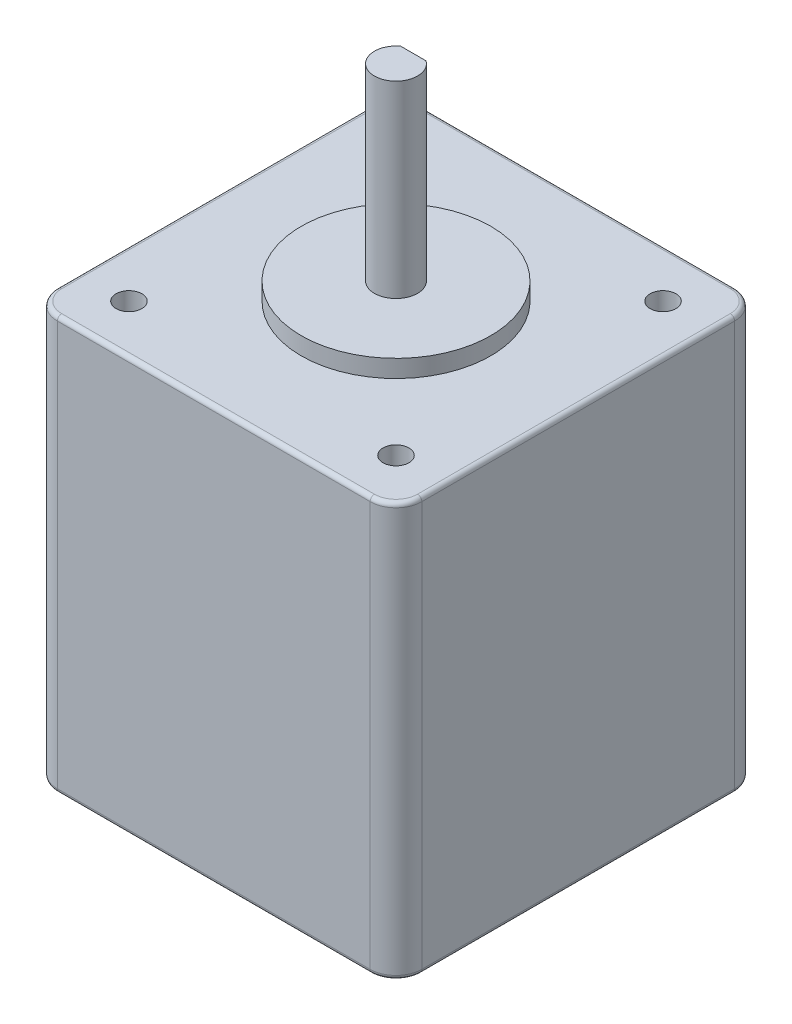
ISO-10303-21;
HEADER;
FILE_DESCRIPTION(('STEP AP214'),'2;1');
FILE_NAME('part.step','',(''),(''),'','','');
FILE_SCHEMA(('AUTOMOTIVE_DESIGN { 1 0 10303 214 1 1 1 1 }'));
ENDSEC;
DATA;
#1=APPLICATION_CONTEXT('core data for automotive mechanical design processes');
#2=APPLICATION_PROTOCOL_DEFINITION('international standard','automotive_design',2000,#1);
#3=PRODUCT_CONTEXT('',#1,'mechanical');
#4=PRODUCT('Part','Part','',(#3));
#5=PRODUCT_RELATED_PRODUCT_CATEGORY('part','',(#4));
#6=PRODUCT_DEFINITION_FORMATION('','',#4);
#7=PRODUCT_DEFINITION_CONTEXT('part definition',#1,'design');
#8=PRODUCT_DEFINITION('design','',#6,#7);
#9=PRODUCT_DEFINITION_SHAPE('','',#8);
#10=(LENGTH_UNIT() NAMED_UNIT(*) SI_UNIT(.MILLI.,.METRE.));
#11=(NAMED_UNIT(*) PLANE_ANGLE_UNIT() SI_UNIT($,.RADIAN.));
#12=(NAMED_UNIT(*) SI_UNIT($,.STERADIAN.) SOLID_ANGLE_UNIT());
#13=UNCERTAINTY_MEASURE_WITH_UNIT(LENGTH_MEASURE(1.E-05),#10,'distance_accuracy_value','');
#14=(GEOMETRIC_REPRESENTATION_CONTEXT(3) GLOBAL_UNCERTAINTY_ASSIGNED_CONTEXT((#13)) GLOBAL_UNIT_ASSIGNED_CONTEXT((#10,
#11,#12)) REPRESENTATION_CONTEXT('',''));
#15=CARTESIAN_POINT('',(0.,0.,0.));
#16=DIRECTION('',(0.,0.,1.));
#17=DIRECTION('',(1.,0.,0.));
#18=AXIS2_PLACEMENT_3D('',#15,#16,#17);
#19=CARTESIAN_POINT('',(0.,48.,0.));
#20=DIRECTION('',(0.,-1.,0.));
#21=DIRECTION('',(0.,0.,-1.));
#22=AXIS2_PLACEMENT_3D('',#19,#20,#21);
#23=PLANE('',#22);
#24=DIRECTION('',(0.,0.,1.));
#25=VECTOR('',#24,1.);
#26=CARTESIAN_POINT('',(0.5,48.,0.));
#27=LINE('',#26,#25);
#28=CARTESIAN_POINT('',(0.5,48.,-39.3));
#29=VERTEX_POINT('',#28);
#30=CARTESIAN_POINT('',(0.5,48.,-3.));
#31=VERTEX_POINT('',#30);
#32=EDGE_CURVE('E50',#29,#31,#27,.T.);
#33=ORIENTED_EDGE('',*,*,#32,.T.);
#34=CARTESIAN_POINT('',(3.,48.,-3.));
#35=DIRECTION('',(0.,-1.,0.));
#36=DIRECTION('',(0.,0.,-1.));
#37=AXIS2_PLACEMENT_3D('',#34,#35,#36);
#38=CIRCLE('',#37,2.5);
#39=CARTESIAN_POINT('',(3.,48.,-0.5));
#40=VERTEX_POINT('',#39);
#41=EDGE_CURVE('E300',#31,#40,#38,.F.);
#42=ORIENTED_EDGE('',*,*,#41,.T.);
#43=DIRECTION('',(1.,0.,0.));
#44=VECTOR('',#43,1.);
#45=CARTESIAN_POINT('',(0.,48.,-0.5));
#46=LINE('',#45,#44);
#47=CARTESIAN_POINT('',(39.3,48.,-0.5));
#48=VERTEX_POINT('',#47);
#49=EDGE_CURVE('E288',#40,#48,#46,.T.);
#50=ORIENTED_EDGE('',*,*,#49,.T.);
#51=CARTESIAN_POINT('',(39.3,48.,-3.));
#52=DIRECTION('',(0.,-1.,0.));
#53=DIRECTION('',(0.,0.,-1.));
#54=AXIS2_PLACEMENT_3D('',#51,#52,#53);
#55=CIRCLE('',#54,2.5);
#56=CARTESIAN_POINT('',(41.8,48.,-3.));
#57=VERTEX_POINT('',#56);
#58=EDGE_CURVE('E290',#48,#57,#55,.F.);
#59=ORIENTED_EDGE('',*,*,#58,.T.);
#60=DIRECTION('',(0.,0.,-1.));
#61=VECTOR('',#60,1.);
#62=CARTESIAN_POINT('',(41.8,48.,0.));
#63=LINE('',#62,#61);
#64=CARTESIAN_POINT('',(41.8,48.,-39.3));
#65=VERTEX_POINT('',#64);
#66=EDGE_CURVE('E292',#57,#65,#63,.T.);
#67=ORIENTED_EDGE('',*,*,#66,.T.);
#68=CARTESIAN_POINT('',(39.3,48.,-39.3));
#69=DIRECTION('',(0.,-1.,0.));
#70=DIRECTION('',(0.,0.,-1.));
#71=AXIS2_PLACEMENT_3D('',#68,#69,#70);
#72=CIRCLE('',#71,2.5);
#73=CARTESIAN_POINT('',(39.3,48.,-41.8));
#74=VERTEX_POINT('',#73);
#75=EDGE_CURVE('E294',#65,#74,#72,.F.);
#76=ORIENTED_EDGE('',*,*,#75,.T.);
#77=DIRECTION('',(-1.,0.,0.));
#78=VECTOR('',#77,1.);
#79=CARTESIAN_POINT('',(0.,48.,-41.8));
#80=LINE('',#79,#78);
#81=CARTESIAN_POINT('',(3.,48.,-41.8));
#82=VERTEX_POINT('',#81);
#83=EDGE_CURVE('E296',#74,#82,#80,.T.);
#84=ORIENTED_EDGE('',*,*,#83,.T.);
#85=CARTESIAN_POINT('',(3.,48.,-39.3));
#86=DIRECTION('',(0.,-1.,0.));
#87=DIRECTION('',(0.,0.,-1.));
#88=AXIS2_PLACEMENT_3D('',#85,#86,#87);
#89=CIRCLE('',#88,2.5);
#90=EDGE_CURVE('E55',#82,#29,#89,.F.);
#91=ORIENTED_EDGE('',*,*,#90,.T.);
#92=EDGE_LOOP('',(#33,#42,#50,#59,#67,#76,#84,#91));
#93=FACE_BOUND('',#92,.T.);
#94=CARTESIAN_POINT('',(21.15,48.,-21.15));
#95=DIRECTION('',(0.,1.,0.));
#96=DIRECTION('',(0.,0.,1.));
#97=AXIS2_PLACEMENT_3D('',#94,#95,#96);
#98=CIRCLE('',#97,11.);
#99=CARTESIAN_POINT('',(21.15,48.,-10.15));
#100=VERTEX_POINT('',#99);
#101=EDGE_CURVE('E189',#100,#100,#98,.T.);
#102=ORIENTED_EDGE('',*,*,#101,.F.);
#103=EDGE_LOOP('',(#102));
#104=FACE_BOUND('',#103,.T.);
#105=CARTESIAN_POINT('',(5.655,48.,-36.645));
#106=DIRECTION('',(0.,1.,0.));
#107=DIRECTION('',(0.,0.,1.));
#108=AXIS2_PLACEMENT_3D('',#105,#106,#107);
#109=CIRCLE('',#108,1.5);
#110=CARTESIAN_POINT('',(5.655,48.,-35.145));
#111=VERTEX_POINT('',#110);
#112=EDGE_CURVE('E195',#111,#111,#109,.T.);
#113=ORIENTED_EDGE('',*,*,#112,.F.);
#114=EDGE_LOOP('',(#113));
#115=FACE_BOUND('',#114,.T.);
#116=CARTESIAN_POINT('',(36.645,48.,-36.645));
#117=DIRECTION('',(0.,1.,0.));
#118=DIRECTION('',(0.,0.,1.));
#119=AXIS2_PLACEMENT_3D('',#116,#117,#118);
#120=CIRCLE('',#119,1.5);
#121=CARTESIAN_POINT('',(36.645,48.,-35.145));
#122=VERTEX_POINT('',#121);
#123=EDGE_CURVE('E208',#122,#122,#120,.T.);
#124=ORIENTED_EDGE('',*,*,#123,.F.);
#125=EDGE_LOOP('',(#124));
#126=FACE_BOUND('',#125,.T.);
#127=CARTESIAN_POINT('',(36.645,48.,-5.655));
#128=DIRECTION('',(0.,1.,0.));
#129=DIRECTION('',(0.,0.,1.));
#130=AXIS2_PLACEMENT_3D('',#127,#128,#129);
#131=CIRCLE('',#130,1.5);
#132=CARTESIAN_POINT('',(36.645,48.,-4.155));
#133=VERTEX_POINT('',#132);
#134=EDGE_CURVE('E202',#133,#133,#131,.T.);
#135=ORIENTED_EDGE('',*,*,#134,.F.);
#136=EDGE_LOOP('',(#135));
#137=FACE_BOUND('',#136,.T.);
#138=CARTESIAN_POINT('',(5.655,48.,-5.655));
#139=DIRECTION('',(0.,1.,0.));
#140=DIRECTION('',(0.,0.,1.));
#141=AXIS2_PLACEMENT_3D('',#138,#139,#140);
#142=CIRCLE('',#141,1.5);
#143=CARTESIAN_POINT('',(5.655,48.,-4.155));
#144=VERTEX_POINT('',#143);
#145=EDGE_CURVE('E196',#144,#144,#142,.T.);
#146=ORIENTED_EDGE('',*,*,#145,.F.);
#147=EDGE_LOOP('',(#146));
#148=FACE_BOUND('',#147,.T.);
#149=ADVANCED_FACE('F33',(#93,#104,#115,#126,#137,#148),#23,.F.);
#150=CARTESIAN_POINT('',(0.,0.,0.));
#151=DIRECTION('',(0.,-1.,0.));
#152=DIRECTION('',(0.,0.,-1.));
#153=AXIS2_PLACEMENT_3D('',#150,#151,#152);
#154=PLANE('',#153);
#155=DIRECTION('',(1.,0.,0.));
#156=VECTOR('',#155,1.);
#157=CARTESIAN_POINT('',(3.,0.,-0.5));
#158=LINE('',#157,#156);
#159=CARTESIAN_POINT('',(39.3,0.,-0.5));
#160=VERTEX_POINT('',#159);
#161=CARTESIAN_POINT('',(3.,0.,-0.5));
#162=VERTEX_POINT('',#161);
#163=EDGE_CURVE('E241',#160,#162,#158,.F.);
#164=ORIENTED_EDGE('',*,*,#163,.T.);
#165=CARTESIAN_POINT('',(3.,0.,-3.));
#166=DIRECTION('',(0.,-1.,0.));
#167=DIRECTION('',(0.,0.,-1.));
#168=AXIS2_PLACEMENT_3D('',#165,#166,#167);
#169=CIRCLE('',#168,2.5);
#170=CARTESIAN_POINT('',(0.5,0.,-3.));
#171=VERTEX_POINT('',#170);
#172=EDGE_CURVE('E255',#162,#171,#169,.T.);
#173=ORIENTED_EDGE('',*,*,#172,.T.);
#174=DIRECTION('',(0.,0.,1.));
#175=VECTOR('',#174,1.);
#176=CARTESIAN_POINT('',(0.5,0.,-39.3));
#177=LINE('',#176,#175);
#178=CARTESIAN_POINT('',(0.5,0.,-39.3));
#179=VERTEX_POINT('',#178);
#180=EDGE_CURVE('E253',#171,#179,#177,.F.);
#181=ORIENTED_EDGE('',*,*,#180,.T.);
#182=CARTESIAN_POINT('',(3.,0.,-39.3));
#183=DIRECTION('',(0.,-1.,0.));
#184=DIRECTION('',(0.,0.,-1.));
#185=AXIS2_PLACEMENT_3D('',#182,#183,#184);
#186=CIRCLE('',#185,2.5);
#187=CARTESIAN_POINT('',(3.,0.,-41.8));
#188=VERTEX_POINT('',#187);
#189=EDGE_CURVE('E251',#179,#188,#186,.T.);
#190=ORIENTED_EDGE('',*,*,#189,.T.);
#191=DIRECTION('',(-1.,0.,0.));
#192=VECTOR('',#191,1.);
#193=CARTESIAN_POINT('',(39.3,0.,-41.8));
#194=LINE('',#193,#192);
#195=CARTESIAN_POINT('',(39.3,0.,-41.8));
#196=VERTEX_POINT('',#195);
#197=EDGE_CURVE('E249',#188,#196,#194,.F.);
#198=ORIENTED_EDGE('',*,*,#197,.T.);
#199=CARTESIAN_POINT('',(39.3,0.,-39.3));
#200=DIRECTION('',(0.,-1.,0.));
#201=DIRECTION('',(0.,0.,-1.));
#202=AXIS2_PLACEMENT_3D('',#199,#200,#201);
#203=CIRCLE('',#202,2.5);
#204=CARTESIAN_POINT('',(41.8,0.,-39.3));
#205=VERTEX_POINT('',#204);
#206=EDGE_CURVE('E247',#196,#205,#203,.T.);
#207=ORIENTED_EDGE('',*,*,#206,.T.);
#208=DIRECTION('',(0.,0.,-1.));
#209=VECTOR('',#208,1.);
#210=CARTESIAN_POINT('',(41.8,0.,-3.));
#211=LINE('',#210,#209);
#212=CARTESIAN_POINT('',(41.8,0.,-3.));
#213=VERTEX_POINT('',#212);
#214=EDGE_CURVE('E245',#205,#213,#211,.F.);
#215=ORIENTED_EDGE('',*,*,#214,.T.);
#216=CARTESIAN_POINT('',(39.3,0.,-3.));
#217=DIRECTION('',(0.,-1.,0.));
#218=DIRECTION('',(0.,0.,-1.));
#219=AXIS2_PLACEMENT_3D('',#216,#217,#218);
#220=CIRCLE('',#219,2.5);
#221=EDGE_CURVE('E243',#213,#160,#220,.T.);
#222=ORIENTED_EDGE('',*,*,#221,.T.);
#223=EDGE_LOOP('',(#164,#173,#181,#190,#198,#207,#215,#222));
#224=FACE_BOUND('',#223,.T.);
#225=CARTESIAN_POINT('',(36.645,0.,-5.655));
#226=DIRECTION('',(0.,1.,0.));
#227=DIRECTION('',(0.,0.,1.));
#228=AXIS2_PLACEMENT_3D('',#225,#226,#227);
#229=CIRCLE('',#228,1.5);
#230=CARTESIAN_POINT('',(36.645,0.,-4.155));
#231=VERTEX_POINT('',#230);
#232=EDGE_CURVE('E199',#231,#231,#229,.T.);
#233=ORIENTED_EDGE('',*,*,#232,.T.);
#234=EDGE_LOOP('',(#233));
#235=FACE_BOUND('',#234,.T.);
#236=CARTESIAN_POINT('',(5.655,0.,-36.645));
#237=DIRECTION('',(0.,1.,0.));
#238=DIRECTION('',(0.,0.,1.));
#239=AXIS2_PLACEMENT_3D('',#236,#237,#238);
#240=CIRCLE('',#239,1.5);
#241=CARTESIAN_POINT('',(5.655,0.,-35.145));
#242=VERTEX_POINT('',#241);
#243=EDGE_CURVE('E211',#242,#242,#240,.T.);
#244=ORIENTED_EDGE('',*,*,#243,.T.);
#245=EDGE_LOOP('',(#244));
#246=FACE_BOUND('',#245,.T.);
#247=CARTESIAN_POINT('',(36.645,0.,-36.645));
#248=DIRECTION('',(0.,1.,0.));
#249=DIRECTION('',(0.,0.,1.));
#250=AXIS2_PLACEMENT_3D('',#247,#248,#249);
#251=CIRCLE('',#250,1.5);
#252=CARTESIAN_POINT('',(36.645,0.,-35.145));
#253=VERTEX_POINT('',#252);
#254=EDGE_CURVE('E205',#253,#253,#251,.T.);
#255=ORIENTED_EDGE('',*,*,#254,.T.);
#256=EDGE_LOOP('',(#255));
#257=FACE_BOUND('',#256,.T.);
#258=CARTESIAN_POINT('',(5.655,0.,-5.655));
#259=DIRECTION('',(0.,1.,0.));
#260=DIRECTION('',(0.,0.,1.));
#261=AXIS2_PLACEMENT_3D('',#258,#259,#260);
#262=CIRCLE('',#261,1.5);
#263=CARTESIAN_POINT('',(5.655,0.,-4.155));
#264=VERTEX_POINT('',#263);
#265=EDGE_CURVE('E192',#264,#264,#262,.T.);
#266=ORIENTED_EDGE('',*,*,#265,.T.);
#267=EDGE_LOOP('',(#266));
#268=FACE_BOUND('',#267,.T.);
#269=ADVANCED_FACE('F377',(#224,#235,#246,#257,#268),#154,.T.);
#270=CARTESIAN_POINT('',(0.,48.,0.));
#271=DIRECTION('',(1.,0.,0.));
#272=DIRECTION('',(0.,0.,-1.));
#273=AXIS2_PLACEMENT_3D('',#270,#271,#272);
#274=PLANE('',#273);
#275=DIRECTION('',(0.,-1.,0.));
#276=VECTOR('',#275,1.);
#277=CARTESIAN_POINT('',(0.,48.,-39.3));
#278=LINE('',#277,#276);
#279=CARTESIAN_POINT('',(0.,47.5,-39.3));
#280=VERTEX_POINT('',#279);
#281=CARTESIAN_POINT('',(0.,0.5,-39.3));
#282=VERTEX_POINT('',#281);
#283=EDGE_CURVE('E220',#280,#282,#278,.T.);
#284=ORIENTED_EDGE('',*,*,#283,.T.);
#285=DIRECTION('',(0.,0.,1.));
#286=VECTOR('',#285,1.);
#287=CARTESIAN_POINT('',(0.,0.5,-3.));
#288=LINE('',#287,#286);
#289=CARTESIAN_POINT('',(0.,0.5,-3.));
#290=VERTEX_POINT('',#289);
#291=EDGE_CURVE('E266',#282,#290,#288,.T.);
#292=ORIENTED_EDGE('',*,*,#291,.T.);
#293=DIRECTION('',(0.,-1.,0.));
#294=VECTOR('',#293,1.);
#295=CARTESIAN_POINT('',(0.,48.,-3.));
#296=LINE('',#295,#294);
#297=CARTESIAN_POINT('',(0.,47.5,-3.));
#298=VERTEX_POINT('',#297);
#299=EDGE_CURVE('E188',#290,#298,#296,.F.);
#300=ORIENTED_EDGE('',*,*,#299,.T.);
#301=DIRECTION('',(0.,0.,1.));
#302=VECTOR('',#301,1.);
#303=CARTESIAN_POINT('',(0.,47.5,0.));
#304=LINE('',#303,#302);
#305=EDGE_CURVE('E264',#298,#280,#304,.F.);
#306=ORIENTED_EDGE('',*,*,#305,.T.);
#307=EDGE_LOOP('',(#284,#292,#300,#306));
#308=FACE_BOUND('',#307,.T.);
#309=ADVANCED_FACE('F408',(#308),#274,.F.);
#310=CARTESIAN_POINT('',(0.,48.,0.));
#311=DIRECTION('',(0.,0.,-1.));
#312=DIRECTION('',(-1.,0.,0.));
#313=AXIS2_PLACEMENT_3D('',#310,#311,#312);
#314=PLANE('',#313);
#315=DIRECTION('',(0.,-1.,0.));
#316=VECTOR('',#315,1.);
#317=CARTESIAN_POINT('',(3.,48.,0.));
#318=LINE('',#317,#316);
#319=CARTESIAN_POINT('',(3.,47.5,0.));
#320=VERTEX_POINT('',#319);
#321=CARTESIAN_POINT('',(3.,0.5,0.));
#322=VERTEX_POINT('',#321);
#323=EDGE_CURVE('E235',#320,#322,#318,.T.);
#324=ORIENTED_EDGE('',*,*,#323,.T.);
#325=DIRECTION('',(1.,0.,0.));
#326=VECTOR('',#325,1.);
#327=CARTESIAN_POINT('',(39.3,0.5,0.));
#328=LINE('',#327,#326);
#329=CARTESIAN_POINT('',(39.3,0.5,0.));
#330=VERTEX_POINT('',#329);
#331=EDGE_CURVE('E11',#322,#330,#328,.T.);
#332=ORIENTED_EDGE('',*,*,#331,.T.);
#333=DIRECTION('',(0.,-1.,0.));
#334=VECTOR('',#333,1.);
#335=CARTESIAN_POINT('',(39.3,48.,0.));
#336=LINE('',#335,#334);
#337=CARTESIAN_POINT('',(39.3,47.5,0.));
#338=VERTEX_POINT('',#337);
#339=EDGE_CURVE('E238',#330,#338,#336,.F.);
#340=ORIENTED_EDGE('',*,*,#339,.T.);
#341=DIRECTION('',(1.,0.,0.));
#342=VECTOR('',#341,1.);
#343=CARTESIAN_POINT('',(0.,47.5,0.));
#344=LINE('',#343,#342);
#345=EDGE_CURVE('E42',#338,#320,#344,.F.);
#346=ORIENTED_EDGE('',*,*,#345,.T.);
#347=EDGE_LOOP('',(#324,#332,#340,#346));
#348=FACE_BOUND('',#347,.T.);
#349=ADVANCED_FACE('F422',(#348),#314,.F.);
#350=CARTESIAN_POINT('',(42.3,48.,0.));
#351=DIRECTION('',(-1.,0.,0.));
#352=DIRECTION('',(0.,0.,1.));
#353=AXIS2_PLACEMENT_3D('',#350,#351,#352);
#354=PLANE('',#353);
#355=DIRECTION('',(0.,-1.,0.));
#356=VECTOR('',#355,1.);
#357=CARTESIAN_POINT('',(42.3,48.,-3.));
#358=LINE('',#357,#356);
#359=CARTESIAN_POINT('',(42.3,47.5,-3.));
#360=VERTEX_POINT('',#359);
#361=CARTESIAN_POINT('',(42.3,0.5,-3.));
#362=VERTEX_POINT('',#361);
#363=EDGE_CURVE('E229',#360,#362,#358,.T.);
#364=ORIENTED_EDGE('',*,*,#363,.T.);
#365=DIRECTION('',(0.,0.,-1.));
#366=VECTOR('',#365,1.);
#367=CARTESIAN_POINT('',(42.3,0.5,-39.3));
#368=LINE('',#367,#366);
#369=CARTESIAN_POINT('',(42.3,0.5,-39.3));
#370=VERTEX_POINT('',#369);
#371=EDGE_CURVE('E282',#362,#370,#368,.T.);
#372=ORIENTED_EDGE('',*,*,#371,.T.);
#373=DIRECTION('',(0.,-1.,0.));
#374=VECTOR('',#373,1.);
#375=CARTESIAN_POINT('',(42.3,48.,-39.3));
#376=LINE('',#375,#374);
#377=CARTESIAN_POINT('',(42.3,47.5,-39.3));
#378=VERTEX_POINT('',#377);
#379=EDGE_CURVE('E232',#370,#378,#376,.F.);
#380=ORIENTED_EDGE('',*,*,#379,.T.);
#381=DIRECTION('',(0.,0.,-1.));
#382=VECTOR('',#381,1.);
#383=CARTESIAN_POINT('',(42.3,47.5,0.));
#384=LINE('',#383,#382);
#385=EDGE_CURVE('E280',#378,#360,#384,.F.);
#386=ORIENTED_EDGE('',*,*,#385,.T.);
#387=EDGE_LOOP('',(#364,#372,#380,#386));
#388=FACE_BOUND('',#387,.T.);
#389=ADVANCED_FACE('F362',(#388),#354,.F.);
#390=CARTESIAN_POINT('',(0.,48.,-42.3));
#391=DIRECTION('',(0.,0.,1.));
#392=DIRECTION('',(1.,0.,0.));
#393=AXIS2_PLACEMENT_3D('',#390,#391,#392);
#394=PLANE('',#393);
#395=DIRECTION('',(0.,-1.,0.));
#396=VECTOR('',#395,1.);
#397=CARTESIAN_POINT('',(39.3,48.,-42.3));
#398=LINE('',#397,#396);
#399=CARTESIAN_POINT('',(39.3,47.5,-42.3));
#400=VERTEX_POINT('',#399);
#401=CARTESIAN_POINT('',(39.3,0.5,-42.3));
#402=VERTEX_POINT('',#401);
#403=EDGE_CURVE('E223',#400,#402,#398,.T.);
#404=ORIENTED_EDGE('',*,*,#403,.T.);
#405=DIRECTION('',(-1.,0.,0.));
#406=VECTOR('',#405,1.);
#407=CARTESIAN_POINT('',(3.,0.5,-42.3));
#408=LINE('',#407,#406);
#409=CARTESIAN_POINT('',(3.,0.5,-42.3));
#410=VERTEX_POINT('',#409);
#411=EDGE_CURVE('E274',#402,#410,#408,.T.);
#412=ORIENTED_EDGE('',*,*,#411,.T.);
#413=DIRECTION('',(0.,-1.,0.));
#414=VECTOR('',#413,1.);
#415=CARTESIAN_POINT('',(3.,48.,-42.3));
#416=LINE('',#415,#414);
#417=CARTESIAN_POINT('',(3.,47.5,-42.3));
#418=VERTEX_POINT('',#417);
#419=EDGE_CURVE('E226',#410,#418,#416,.F.);
#420=ORIENTED_EDGE('',*,*,#419,.T.);
#421=DIRECTION('',(-1.,0.,0.));
#422=VECTOR('',#421,1.);
#423=CARTESIAN_POINT('',(0.,47.5,-42.3));
#424=LINE('',#423,#422);
#425=EDGE_CURVE('E272',#418,#400,#424,.F.);
#426=ORIENTED_EDGE('',*,*,#425,.T.);
#427=EDGE_LOOP('',(#404,#412,#420,#426));
#428=FACE_BOUND('',#427,.T.);
#429=ADVANCED_FACE('F387',(#428),#394,.F.);
#430=CARTESIAN_POINT('',(5.655,48.,-36.645));
#431=DIRECTION('',(0.,-1.,0.));
#432=DIRECTION('',(0.,0.,-1.));
#433=AXIS2_PLACEMENT_3D('',#430,#431,#432);
#434=CYLINDRICAL_SURFACE('',#433,1.5);
#435=ORIENTED_EDGE('',*,*,#112,.T.);
#436=EDGE_LOOP('',(#435));
#437=FACE_BOUND('',#436,.T.);
#438=ORIENTED_EDGE('',*,*,#243,.F.);
#439=EDGE_LOOP('',(#438));
#440=FACE_BOUND('',#439,.T.);
#441=ADVANCED_FACE('F461',(#437,#440),#434,.F.);
#442=CARTESIAN_POINT('',(36.645,48.,-36.645));
#443=DIRECTION('',(0.,-1.,0.));
#444=DIRECTION('',(0.,0.,-1.));
#445=AXIS2_PLACEMENT_3D('',#442,#443,#444);
#446=CYLINDRICAL_SURFACE('',#445,1.5);
#447=ORIENTED_EDGE('',*,*,#123,.T.);
#448=EDGE_LOOP('',(#447));
#449=FACE_BOUND('',#448,.T.);
#450=ORIENTED_EDGE('',*,*,#254,.F.);
#451=EDGE_LOOP('',(#450));
#452=FACE_BOUND('',#451,.T.);
#453=ADVANCED_FACE('F671',(#449,#452),#446,.F.);
#454=CARTESIAN_POINT('',(36.645,48.,-5.655));
#455=DIRECTION('',(0.,-1.,0.));
#456=DIRECTION('',(0.,0.,-1.));
#457=AXIS2_PLACEMENT_3D('',#454,#455,#456);
#458=CYLINDRICAL_SURFACE('',#457,1.5);
#459=ORIENTED_EDGE('',*,*,#134,.T.);
#460=EDGE_LOOP('',(#459));
#461=FACE_BOUND('',#460,.T.);
#462=ORIENTED_EDGE('',*,*,#232,.F.);
#463=EDGE_LOOP('',(#462));
#464=FACE_BOUND('',#463,.T.);
#465=ADVANCED_FACE('F662',(#461,#464),#458,.F.);
#466=CARTESIAN_POINT('',(5.655,48.,-5.655));
#467=DIRECTION('',(0.,-1.,0.));
#468=DIRECTION('',(0.,0.,-1.));
#469=AXIS2_PLACEMENT_3D('',#466,#467,#468);
#470=CYLINDRICAL_SURFACE('',#469,1.5);
#471=ORIENTED_EDGE('',*,*,#145,.T.);
#472=EDGE_LOOP('',(#471));
#473=FACE_BOUND('',#472,.T.);
#474=ORIENTED_EDGE('',*,*,#265,.F.);
#475=EDGE_LOOP('',(#474));
#476=FACE_BOUND('',#475,.T.);
#477=ADVANCED_FACE('F653',(#473,#476),#470,.F.);
#478=CARTESIAN_POINT('',(21.15,50.03,-21.15));
#479=DIRECTION('',(0.,-1.,0.));
#480=DIRECTION('',(0.,0.,-1.));
#481=AXIS2_PLACEMENT_3D('',#478,#479,#480);
#482=CYLINDRICAL_SURFACE('',#481,11.);
#483=CARTESIAN_POINT('',(21.15,50.03,-21.15));
#484=DIRECTION('',(0.,1.,0.));
#485=DIRECTION('',(0.,0.,1.));
#486=AXIS2_PLACEMENT_3D('',#483,#484,#485);
#487=CIRCLE('',#486,11.);
#488=CARTESIAN_POINT('',(21.15,50.03,-10.15));
#489=VERTEX_POINT('',#488);
#490=EDGE_CURVE('E184',#489,#489,#487,.T.);
#491=ORIENTED_EDGE('',*,*,#490,.F.);
#492=EDGE_LOOP('',(#491));
#493=FACE_BOUND('',#492,.T.);
#494=ORIENTED_EDGE('',*,*,#101,.T.);
#495=EDGE_LOOP('',(#494));
#496=FACE_BOUND('',#495,.T.);
#497=ADVANCED_FACE('F644',(#493,#496),#482,.T.);
#498=CARTESIAN_POINT('',(21.15,50.03,-21.15));
#499=DIRECTION('',(0.,1.,0.));
#500=DIRECTION('',(0.,0.,1.));
#501=AXIS2_PLACEMENT_3D('',#498,#499,#500);
#502=PLANE('',#501);
#503=CARTESIAN_POINT('',(21.15,50.03,-21.15));
#504=DIRECTION('',(0.,1.,0.));
#505=DIRECTION('',(0.,0.,1.));
#506=AXIS2_PLACEMENT_3D('',#503,#504,#505);
#507=CIRCLE('',#506,2.5);
#508=CARTESIAN_POINT('',(21.15,50.03,-18.65));
#509=VERTEX_POINT('',#508);
#510=EDGE_CURVE('E185',#509,#509,#507,.T.);
#511=ORIENTED_EDGE('',*,*,#510,.F.);
#512=EDGE_LOOP('',(#511));
#513=FACE_BOUND('',#512,.T.);
#514=ORIENTED_EDGE('',*,*,#490,.T.);
#515=EDGE_LOOP('',(#514));
#516=FACE_BOUND('',#515,.T.);
#517=ADVANCED_FACE('F636',(#513,#516),#502,.T.);
#518=CARTESIAN_POINT('',(21.15,71.88,-21.15));
#519=DIRECTION('',(0.,-1.,0.));
#520=DIRECTION('',(0.,0.,-1.));
#521=AXIS2_PLACEMENT_3D('',#518,#519,#520);
#522=CYLINDRICAL_SURFACE('',#521,2.5);
#523=CARTESIAN_POINT('',(21.15,71.88,-21.15));
#524=DIRECTION('',(0.,1.,0.));
#525=DIRECTION('',(0.,0.,1.));
#526=AXIS2_PLACEMENT_3D('',#523,#524,#525);
#527=CIRCLE('',#526,2.5);
#528=CARTESIAN_POINT('',(19.6770437888383,71.88,-23.17));
#529=VERTEX_POINT('',#528);
#530=CARTESIAN_POINT('',(22.6229562111618,71.88,-23.17));
#531=VERTEX_POINT('',#530);
#532=EDGE_CURVE('E178',#529,#531,#527,.T.);
#533=ORIENTED_EDGE('',*,*,#532,.F.);
#534=DIRECTION('',(0.,1.,0.));
#535=VECTOR('',#534,1.);
#536=CARTESIAN_POINT('',(19.6770437888383,57.02,-23.17));
#537=LINE('',#536,#535);
#538=CARTESIAN_POINT('',(19.6770437888383,57.02,-23.17));
#539=VERTEX_POINT('',#538);
#540=EDGE_CURVE('E170',#539,#529,#537,.T.);
#541=ORIENTED_EDGE('',*,*,#540,.F.);
#542=CARTESIAN_POINT('',(21.15,57.02,-21.15));
#543=DIRECTION('',(0.,1.,0.));
#544=DIRECTION('',(0.,0.,-1.));
#545=AXIS2_PLACEMENT_3D('',#542,#543,#544);
#546=CIRCLE('',#545,2.5);
#547=CARTESIAN_POINT('',(22.6229562111618,57.02,-23.17));
#548=VERTEX_POINT('',#547);
#549=EDGE_CURVE('E159',#548,#539,#546,.T.);
#550=ORIENTED_EDGE('',*,*,#549,.F.);
#551=DIRECTION('',(0.,1.,0.));
#552=VECTOR('',#551,1.);
#553=CARTESIAN_POINT('',(22.6229562111618,57.02,-23.17));
#554=LINE('',#553,#552);
#555=EDGE_CURVE('E172',#548,#531,#554,.T.);
#556=ORIENTED_EDGE('',*,*,#555,.T.);
#557=EDGE_LOOP('',(#533,#541,#550,#556));
#558=FACE_BOUND('',#557,.T.);
#559=ORIENTED_EDGE('',*,*,#510,.T.);
#560=EDGE_LOOP('',(#559));
#561=FACE_BOUND('',#560,.T.);
#562=ADVANCED_FACE('F175',(#558,#561),#522,.T.);
#563=CARTESIAN_POINT('',(21.15,71.88,-21.15));
#564=DIRECTION('',(0.,1.,0.));
#565=DIRECTION('',(0.,0.,1.));
#566=AXIS2_PLACEMENT_3D('',#563,#564,#565);
#567=PLANE('',#566);
#568=DIRECTION('',(1.,0.,0.));
#569=VECTOR('',#568,1.);
#570=CARTESIAN_POINT('',(19.6770437888383,71.88,-23.17));
#571=LINE('',#570,#569);
#572=EDGE_CURVE('E166',#529,#531,#571,.T.);
#573=ORIENTED_EDGE('',*,*,#572,.F.);
#574=ORIENTED_EDGE('',*,*,#532,.T.);
#575=EDGE_LOOP('',(#573,#574));
#576=FACE_BOUND('',#575,.T.);
#577=ADVANCED_FACE('F620',(#576),#567,.T.);
#578=CARTESIAN_POINT('',(19.6770437888383,57.02,-23.17));
#579=DIRECTION('',(0.,0.,1.));
#580=DIRECTION('',(1.,0.,0.));
#581=AXIS2_PLACEMENT_3D('',#578,#579,#580);
#582=PLANE('',#581);
#583=ORIENTED_EDGE('',*,*,#572,.T.);
#584=ORIENTED_EDGE('',*,*,#555,.F.);
#585=DIRECTION('',(1.,0.,0.));
#586=VECTOR('',#585,1.);
#587=CARTESIAN_POINT('',(19.6770437888383,57.02,-23.17));
#588=LINE('',#587,#586);
#589=EDGE_CURVE('E162',#539,#548,#588,.T.);
#590=ORIENTED_EDGE('',*,*,#589,.F.);
#591=ORIENTED_EDGE('',*,*,#540,.T.);
#592=EDGE_LOOP('',(#583,#584,#590,#591));
#593=FACE_BOUND('',#592,.T.);
#594=ADVANCED_FACE('F169',(#593),#582,.F.);
#595=CARTESIAN_POINT('',(21.15,57.02,-21.15));
#596=DIRECTION('',(0.,-1.,0.));
#597=DIRECTION('',(0.,0.,-1.));
#598=AXIS2_PLACEMENT_3D('',#595,#596,#597);
#599=PLANE('',#598);
#600=ORIENTED_EDGE('',*,*,#549,.T.);
#601=ORIENTED_EDGE('',*,*,#589,.T.);
#602=EDGE_LOOP('',(#600,#601));
#603=FACE_BOUND('',#602,.T.);
#604=ADVANCED_FACE('F161',(#603),#599,.F.);
#605=CARTESIAN_POINT('',(3.,48.,-39.3));
#606=DIRECTION('',(0.,-1.,0.));
#607=DIRECTION('',(0.,0.,-1.));
#608=AXIS2_PLACEMENT_3D('',#605,#606,#607);
#609=CYLINDRICAL_SURFACE('',#608,3.);
#610=ORIENTED_EDGE('',*,*,#419,.F.);
#611=CARTESIAN_POINT('',(3.,0.5,-39.3));
#612=DIRECTION('',(0.,-1.,0.));
#613=DIRECTION('',(0.,0.,-1.));
#614=AXIS2_PLACEMENT_3D('',#611,#612,#613);
#615=CIRCLE('',#614,3.);
#616=EDGE_CURVE('E270',#410,#282,#615,.F.);
#617=ORIENTED_EDGE('',*,*,#616,.T.);
#618=ORIENTED_EDGE('',*,*,#283,.F.);
#619=CARTESIAN_POINT('',(3.,47.5,-39.3));
#620=DIRECTION('',(0.,-1.,0.));
#621=DIRECTION('',(0.,0.,-1.));
#622=AXIS2_PLACEMENT_3D('',#619,#620,#621);
#623=CIRCLE('',#622,3.);
#624=EDGE_CURVE('E268',#280,#418,#623,.T.);
#625=ORIENTED_EDGE('',*,*,#624,.T.);
#626=EDGE_LOOP('',(#610,#617,#618,#625));
#627=FACE_BOUND('',#626,.T.);
#628=ADVANCED_FACE('F391',(#627),#609,.T.);
#629=CARTESIAN_POINT('',(39.3,48.,-39.3));
#630=DIRECTION('',(0.,-1.,0.));
#631=DIRECTION('',(0.,0.,-1.));
#632=AXIS2_PLACEMENT_3D('',#629,#630,#631);
#633=CYLINDRICAL_SURFACE('',#632,3.);
#634=ORIENTED_EDGE('',*,*,#379,.F.);
#635=CARTESIAN_POINT('',(39.3,0.5,-39.3));
#636=DIRECTION('',(0.,-1.,0.));
#637=DIRECTION('',(0.,0.,-1.));
#638=AXIS2_PLACEMENT_3D('',#635,#636,#637);
#639=CIRCLE('',#638,3.);
#640=EDGE_CURVE('E278',#370,#402,#639,.F.);
#641=ORIENTED_EDGE('',*,*,#640,.T.);
#642=ORIENTED_EDGE('',*,*,#403,.F.);
#643=CARTESIAN_POINT('',(39.3,47.5,-39.3));
#644=DIRECTION('',(0.,-1.,0.));
#645=DIRECTION('',(0.,0.,-1.));
#646=AXIS2_PLACEMENT_3D('',#643,#644,#645);
#647=CIRCLE('',#646,3.);
#648=EDGE_CURVE('E276',#400,#378,#647,.T.);
#649=ORIENTED_EDGE('',*,*,#648,.T.);
#650=EDGE_LOOP('',(#634,#641,#642,#649));
#651=FACE_BOUND('',#650,.T.);
#652=ADVANCED_FACE('F359',(#651),#633,.T.);
#653=CARTESIAN_POINT('',(39.3,48.,-3.));
#654=DIRECTION('',(0.,-1.,0.));
#655=DIRECTION('',(0.,0.,-1.));
#656=AXIS2_PLACEMENT_3D('',#653,#654,#655);
#657=CYLINDRICAL_SURFACE('',#656,3.);
#658=ORIENTED_EDGE('',*,*,#339,.F.);
#659=CARTESIAN_POINT('',(39.3,0.5,-3.));
#660=DIRECTION('',(0.,-1.,0.));
#661=DIRECTION('',(0.,0.,-1.));
#662=AXIS2_PLACEMENT_3D('',#659,#660,#661);
#663=CIRCLE('',#662,3.);
#664=EDGE_CURVE('E286',#330,#362,#663,.F.);
#665=ORIENTED_EDGE('',*,*,#664,.T.);
#666=ORIENTED_EDGE('',*,*,#363,.F.);
#667=CARTESIAN_POINT('',(39.3,47.5,-3.));
#668=DIRECTION('',(0.,-1.,0.));
#669=DIRECTION('',(0.,0.,-1.));
#670=AXIS2_PLACEMENT_3D('',#667,#668,#669);
#671=CIRCLE('',#670,3.);
#672=EDGE_CURVE('E284',#360,#338,#671,.T.);
#673=ORIENTED_EDGE('',*,*,#672,.T.);
#674=EDGE_LOOP('',(#658,#665,#666,#673));
#675=FACE_BOUND('',#674,.T.);
#676=ADVANCED_FACE('F425',(#675),#657,.T.);
#677=CARTESIAN_POINT('',(3.,48.,-3.));
#678=DIRECTION('',(0.,-1.,0.));
#679=DIRECTION('',(0.,0.,-1.));
#680=AXIS2_PLACEMENT_3D('',#677,#678,#679);
#681=CYLINDRICAL_SURFACE('',#680,3.);
#682=ORIENTED_EDGE('',*,*,#299,.F.);
#683=CARTESIAN_POINT('',(3.,0.5,-3.));
#684=DIRECTION('',(0.,-1.,0.));
#685=DIRECTION('',(0.,0.,-1.));
#686=AXIS2_PLACEMENT_3D('',#683,#684,#685);
#687=CIRCLE('',#686,3.);
#688=EDGE_CURVE('E261',#290,#322,#687,.F.);
#689=ORIENTED_EDGE('',*,*,#688,.T.);
#690=ORIENTED_EDGE('',*,*,#323,.F.);
#691=CARTESIAN_POINT('',(3.,47.5,-3.));
#692=DIRECTION('',(0.,-1.,0.));
#693=DIRECTION('',(0.,0.,-1.));
#694=AXIS2_PLACEMENT_3D('',#691,#692,#693);
#695=CIRCLE('',#694,3.);
#696=EDGE_CURVE('E258',#320,#298,#695,.T.);
#697=ORIENTED_EDGE('',*,*,#696,.T.);
#698=EDGE_LOOP('',(#682,#689,#690,#697));
#699=FACE_BOUND('',#698,.T.);
#700=ADVANCED_FACE('F411',(#699),#681,.T.);
#701=CARTESIAN_POINT('',(39.3,0.5,-39.3));
#702=DIRECTION('',(0.,-1.,0.));
#703=DIRECTION('',(0.,0.,-1.));
#704=AXIS2_PLACEMENT_3D('',#701,#702,#703);
#705=TOROIDAL_SURFACE('',#704,2.5,0.5);
#706=CARTESIAN_POINT('',(39.3,0.5,-41.8));
#707=DIRECTION('',(-1.,0.,0.));
#708=DIRECTION('',(0.,0.,1.));
#709=AXIS2_PLACEMENT_3D('',#706,#707,#708);
#710=CIRCLE('',#709,0.5);
#711=EDGE_CURVE('E319',#402,#196,#710,.T.);
#712=ORIENTED_EDGE('',*,*,#711,.F.);
#713=ORIENTED_EDGE('',*,*,#640,.F.);
#714=CARTESIAN_POINT('',(41.8,0.5,-39.3));
#715=DIRECTION('',(0.,0.,1.));
#716=DIRECTION('',(1.,0.,0.));
#717=AXIS2_PLACEMENT_3D('',#714,#715,#716);
#718=CIRCLE('',#717,0.5);
#719=EDGE_CURVE('E322',#205,#370,#718,.T.);
#720=ORIENTED_EDGE('',*,*,#719,.F.);
#721=ORIENTED_EDGE('',*,*,#206,.F.);
#722=EDGE_LOOP('',(#712,#713,#720,#721));
#723=FACE_BOUND('',#722,.T.);
#724=ADVANCED_FACE('F384',(#723),#705,.T.);
#725=CARTESIAN_POINT('',(41.8,0.5,0.));
#726=DIRECTION('',(0.,0.,1.));
#727=DIRECTION('',(1.,0.,0.));
#728=AXIS2_PLACEMENT_3D('',#725,#726,#727);
#729=CYLINDRICAL_SURFACE('',#728,0.5);
#730=ORIENTED_EDGE('',*,*,#719,.T.);
#731=ORIENTED_EDGE('',*,*,#371,.F.);
#732=CARTESIAN_POINT('',(41.8,0.5,-3.));
#733=DIRECTION('',(0.,0.,1.));
#734=DIRECTION('',(1.,0.,0.));
#735=AXIS2_PLACEMENT_3D('',#732,#733,#734);
#736=CIRCLE('',#735,0.5);
#737=EDGE_CURVE('E316',#213,#362,#736,.T.);
#738=ORIENTED_EDGE('',*,*,#737,.F.);
#739=ORIENTED_EDGE('',*,*,#214,.F.);
#740=EDGE_LOOP('',(#730,#731,#738,#739));
#741=FACE_BOUND('',#740,.T.);
#742=ADVANCED_FACE('F367',(#741),#729,.T.);
#743=CARTESIAN_POINT('',(0.,0.5,-41.8));
#744=DIRECTION('',(1.,0.,0.));
#745=DIRECTION('',(0.,0.,-1.));
#746=AXIS2_PLACEMENT_3D('',#743,#744,#745);
#747=CYLINDRICAL_SURFACE('',#746,0.5);
#748=ORIENTED_EDGE('',*,*,#711,.T.);
#749=ORIENTED_EDGE('',*,*,#197,.F.);
#750=CARTESIAN_POINT('',(3.,0.5,-41.8));
#751=DIRECTION('',(-1.,0.,0.));
#752=DIRECTION('',(0.,0.,1.));
#753=AXIS2_PLACEMENT_3D('',#750,#751,#752);
#754=CIRCLE('',#753,0.5);
#755=EDGE_CURVE('E313',#410,#188,#754,.T.);
#756=ORIENTED_EDGE('',*,*,#755,.F.);
#757=ORIENTED_EDGE('',*,*,#411,.F.);
#758=EDGE_LOOP('',(#748,#749,#756,#757));
#759=FACE_BOUND('',#758,.T.);
#760=ADVANCED_FACE('F396',(#759),#747,.T.);
#761=CARTESIAN_POINT('',(39.3,0.5,-3.));
#762=DIRECTION('',(0.,-1.,0.));
#763=DIRECTION('',(0.,0.,-1.));
#764=AXIS2_PLACEMENT_3D('',#761,#762,#763);
#765=TOROIDAL_SURFACE('',#764,2.5,0.5);
#766=ORIENTED_EDGE('',*,*,#737,.T.);
#767=ORIENTED_EDGE('',*,*,#664,.F.);
#768=CARTESIAN_POINT('',(39.3,0.5,-0.5));
#769=DIRECTION('',(-1.,0.,0.));
#770=DIRECTION('',(0.,0.,1.));
#771=AXIS2_PLACEMENT_3D('',#768,#769,#770);
#772=CIRCLE('',#771,0.5);
#773=EDGE_CURVE('E310',#160,#330,#772,.T.);
#774=ORIENTED_EDGE('',*,*,#773,.F.);
#775=ORIENTED_EDGE('',*,*,#221,.F.);
#776=EDGE_LOOP('',(#766,#767,#774,#775));
#777=FACE_BOUND('',#776,.T.);
#778=ADVANCED_FACE('F373',(#777),#765,.T.);
#779=CARTESIAN_POINT('',(3.,0.5,-39.3));
#780=DIRECTION('',(0.,-1.,0.));
#781=DIRECTION('',(0.,0.,-1.));
#782=AXIS2_PLACEMENT_3D('',#779,#780,#781);
#783=TOROIDAL_SURFACE('',#782,2.5,0.5);
#784=ORIENTED_EDGE('',*,*,#755,.T.);
#785=ORIENTED_EDGE('',*,*,#189,.F.);
#786=CARTESIAN_POINT('',(0.5,0.5,-39.3));
#787=DIRECTION('',(0.,0.,1.));
#788=DIRECTION('',(1.,0.,0.));
#789=AXIS2_PLACEMENT_3D('',#786,#787,#788);
#790=CIRCLE('',#789,0.5);
#791=EDGE_CURVE('E307',#282,#179,#790,.T.);
#792=ORIENTED_EDGE('',*,*,#791,.F.);
#793=ORIENTED_EDGE('',*,*,#616,.F.);
#794=EDGE_LOOP('',(#784,#785,#792,#793));
#795=FACE_BOUND('',#794,.T.);
#796=ADVANCED_FACE('F400',(#795),#783,.T.);
#797=CARTESIAN_POINT('',(0.,0.5,-0.5));
#798=DIRECTION('',(-1.,0.,0.));
#799=DIRECTION('',(0.,0.,1.));
#800=AXIS2_PLACEMENT_3D('',#797,#798,#799);
#801=CYLINDRICAL_SURFACE('',#800,0.5);
#802=ORIENTED_EDGE('',*,*,#773,.T.);
#803=ORIENTED_EDGE('',*,*,#331,.F.);
#804=CARTESIAN_POINT('',(3.,0.5,-0.5));
#805=DIRECTION('',(-1.,0.,0.));
#806=DIRECTION('',(0.,0.,1.));
#807=AXIS2_PLACEMENT_3D('',#804,#805,#806);
#808=CIRCLE('',#807,0.5);
#809=EDGE_CURVE('E305',#162,#322,#808,.T.);
#810=ORIENTED_EDGE('',*,*,#809,.F.);
#811=ORIENTED_EDGE('',*,*,#163,.F.);
#812=EDGE_LOOP('',(#802,#803,#810,#811));
#813=FACE_BOUND('',#812,.T.);
#814=ADVANCED_FACE('F419',(#813),#801,.T.);
#815=CARTESIAN_POINT('',(0.5,0.5,0.));
#816=DIRECTION('',(0.,0.,-1.));
#817=DIRECTION('',(-1.,0.,0.));
#818=AXIS2_PLACEMENT_3D('',#815,#816,#817);
#819=CYLINDRICAL_SURFACE('',#818,0.5);
#820=ORIENTED_EDGE('',*,*,#791,.T.);
#821=ORIENTED_EDGE('',*,*,#180,.F.);
#822=CARTESIAN_POINT('',(0.5,0.5,-3.));
#823=DIRECTION('',(0.,0.,1.));
#824=DIRECTION('',(1.,0.,0.));
#825=AXIS2_PLACEMENT_3D('',#822,#823,#824);
#826=CIRCLE('',#825,0.5);
#827=EDGE_CURVE('E303',#290,#171,#826,.T.);
#828=ORIENTED_EDGE('',*,*,#827,.F.);
#829=ORIENTED_EDGE('',*,*,#291,.F.);
#830=EDGE_LOOP('',(#820,#821,#828,#829));
#831=FACE_BOUND('',#830,.T.);
#832=ADVANCED_FACE('F405',(#831),#819,.T.);
#833=CARTESIAN_POINT('',(3.,0.5,-3.));
#834=DIRECTION('',(0.,-1.,0.));
#835=DIRECTION('',(0.,0.,-1.));
#836=AXIS2_PLACEMENT_3D('',#833,#834,#835);
#837=TOROIDAL_SURFACE('',#836,2.5,0.5);
#838=ORIENTED_EDGE('',*,*,#809,.T.);
#839=ORIENTED_EDGE('',*,*,#688,.F.);
#840=ORIENTED_EDGE('',*,*,#827,.T.);
#841=ORIENTED_EDGE('',*,*,#172,.F.);
#842=EDGE_LOOP('',(#838,#839,#840,#841));
#843=FACE_BOUND('',#842,.T.);
#844=ADVANCED_FACE('F415',(#843),#837,.T.);
#845=CARTESIAN_POINT('',(39.3,47.5,-39.3));
#846=DIRECTION('',(0.,-1.,0.));
#847=DIRECTION('',(0.,0.,-1.));
#848=AXIS2_PLACEMENT_3D('',#845,#846,#847);
#849=TOROIDAL_SURFACE('',#848,2.5,0.5);
#850=CARTESIAN_POINT('',(41.8,47.5,-39.3));
#851=DIRECTION('',(0.,0.,1.));
#852=DIRECTION('',(1.,0.,0.));
#853=AXIS2_PLACEMENT_3D('',#850,#851,#852);
#854=CIRCLE('',#853,0.5);
#855=EDGE_CURVE('E340',#378,#65,#854,.T.);
#856=ORIENTED_EDGE('',*,*,#855,.F.);
#857=ORIENTED_EDGE('',*,*,#648,.F.);
#858=CARTESIAN_POINT('',(39.3,47.5,-41.8));
#859=DIRECTION('',(-1.,0.,0.));
#860=DIRECTION('',(0.,0.,1.));
#861=AXIS2_PLACEMENT_3D('',#858,#859,#860);
#862=CIRCLE('',#861,0.5);
#863=EDGE_CURVE('E37',#74,#400,#862,.T.);
#864=ORIENTED_EDGE('',*,*,#863,.F.);
#865=ORIENTED_EDGE('',*,*,#75,.F.);
#866=EDGE_LOOP('',(#856,#857,#864,#865));
#867=FACE_BOUND('',#866,.T.);
#868=ADVANCED_FACE('F35',(#867),#849,.T.);
#869=CARTESIAN_POINT('',(0.,47.5,-41.8));
#870=DIRECTION('',(-1.,0.,0.));
#871=DIRECTION('',(0.,0.,1.));
#872=AXIS2_PLACEMENT_3D('',#869,#870,#871);
#873=CYLINDRICAL_SURFACE('',#872,0.5);
#874=ORIENTED_EDGE('',*,*,#863,.T.);
#875=ORIENTED_EDGE('',*,*,#425,.F.);
#876=CARTESIAN_POINT('',(3.,47.5,-41.8));
#877=DIRECTION('',(-1.,0.,0.));
#878=DIRECTION('',(0.,0.,1.));
#879=AXIS2_PLACEMENT_3D('',#876,#877,#878);
#880=CIRCLE('',#879,0.5);
#881=EDGE_CURVE('E338',#82,#418,#880,.T.);
#882=ORIENTED_EDGE('',*,*,#881,.F.);
#883=ORIENTED_EDGE('',*,*,#83,.F.);
#884=EDGE_LOOP('',(#874,#875,#882,#883));
#885=FACE_BOUND('',#884,.T.);
#886=ADVANCED_FACE('F351',(#885),#873,.T.);
#887=CARTESIAN_POINT('',(41.8,47.5,0.));
#888=DIRECTION('',(0.,0.,-1.));
#889=DIRECTION('',(-1.,0.,0.));
#890=AXIS2_PLACEMENT_3D('',#887,#888,#889);
#891=CYLINDRICAL_SURFACE('',#890,0.5);
#892=ORIENTED_EDGE('',*,*,#855,.T.);
#893=ORIENTED_EDGE('',*,*,#66,.F.);
#894=CARTESIAN_POINT('',(41.8,47.5,-3.));
#895=DIRECTION('',(0.,0.,1.));
#896=DIRECTION('',(1.,0.,0.));
#897=AXIS2_PLACEMENT_3D('',#894,#895,#896);
#898=CIRCLE('',#897,0.5);
#899=EDGE_CURVE('E335',#360,#57,#898,.T.);
#900=ORIENTED_EDGE('',*,*,#899,.F.);
#901=ORIENTED_EDGE('',*,*,#385,.F.);
#902=EDGE_LOOP('',(#892,#893,#900,#901));
#903=FACE_BOUND('',#902,.T.);
#904=ADVANCED_FACE('F445',(#903),#891,.T.);
#905=CARTESIAN_POINT('',(3.,47.5,-39.3));
#906=DIRECTION('',(0.,-1.,0.));
#907=DIRECTION('',(0.,0.,-1.));
#908=AXIS2_PLACEMENT_3D('',#905,#906,#907);
#909=TOROIDAL_SURFACE('',#908,2.5,0.5);
#910=ORIENTED_EDGE('',*,*,#881,.T.);
#911=ORIENTED_EDGE('',*,*,#624,.F.);
#912=CARTESIAN_POINT('',(0.5,47.5,-39.3));
#913=DIRECTION('',(0.,0.,1.));
#914=DIRECTION('',(1.,0.,0.));
#915=AXIS2_PLACEMENT_3D('',#912,#913,#914);
#916=CIRCLE('',#915,0.5);
#917=EDGE_CURVE('E332',#29,#280,#916,.T.);
#918=ORIENTED_EDGE('',*,*,#917,.F.);
#919=ORIENTED_EDGE('',*,*,#90,.F.);
#920=EDGE_LOOP('',(#910,#911,#918,#919));
#921=FACE_BOUND('',#920,.T.);
#922=ADVANCED_FACE('F443',(#921),#909,.T.);
#923=CARTESIAN_POINT('',(39.3,47.5,-3.));
#924=DIRECTION('',(0.,-1.,0.));
#925=DIRECTION('',(0.,0.,-1.));
#926=AXIS2_PLACEMENT_3D('',#923,#924,#925);
#927=TOROIDAL_SURFACE('',#926,2.5,0.5);
#928=ORIENTED_EDGE('',*,*,#899,.T.);
#929=ORIENTED_EDGE('',*,*,#58,.F.);
#930=CARTESIAN_POINT('',(39.3,47.5,-0.5));
#931=DIRECTION('',(-1.,0.,0.));
#932=DIRECTION('',(0.,0.,1.));
#933=AXIS2_PLACEMENT_3D('',#930,#931,#932);
#934=CIRCLE('',#933,0.5);
#935=EDGE_CURVE('E329',#338,#48,#934,.T.);
#936=ORIENTED_EDGE('',*,*,#935,.F.);
#937=ORIENTED_EDGE('',*,*,#672,.F.);
#938=EDGE_LOOP('',(#928,#929,#936,#937));
#939=FACE_BOUND('',#938,.T.);
#940=ADVANCED_FACE('F429',(#939),#927,.T.);
#941=CARTESIAN_POINT('',(0.5,47.5,0.));
#942=DIRECTION('',(0.,0.,1.));
#943=DIRECTION('',(1.,0.,0.));
#944=AXIS2_PLACEMENT_3D('',#941,#942,#943);
#945=CYLINDRICAL_SURFACE('',#944,0.5);
#946=ORIENTED_EDGE('',*,*,#917,.T.);
#947=ORIENTED_EDGE('',*,*,#305,.F.);
#948=CARTESIAN_POINT('',(0.5,47.5,-3.));
#949=DIRECTION('',(0.,0.,1.));
#950=DIRECTION('',(1.,0.,0.));
#951=AXIS2_PLACEMENT_3D('',#948,#949,#950);
#952=CIRCLE('',#951,0.5);
#953=EDGE_CURVE('E327',#31,#298,#952,.T.);
#954=ORIENTED_EDGE('',*,*,#953,.F.);
#955=ORIENTED_EDGE('',*,*,#32,.F.);
#956=EDGE_LOOP('',(#946,#947,#954,#955));
#957=FACE_BOUND('',#956,.T.);
#958=ADVANCED_FACE('F441',(#957),#945,.T.);
#959=CARTESIAN_POINT('',(0.,47.5,-0.5));
#960=DIRECTION('',(1.,0.,0.));
#961=DIRECTION('',(0.,0.,-1.));
#962=AXIS2_PLACEMENT_3D('',#959,#960,#961);
#963=CYLINDRICAL_SURFACE('',#962,0.5);
#964=ORIENTED_EDGE('',*,*,#935,.T.);
#965=ORIENTED_EDGE('',*,*,#49,.F.);
#966=CARTESIAN_POINT('',(3.,47.5,-0.5));
#967=DIRECTION('',(-1.,0.,0.));
#968=DIRECTION('',(0.,0.,1.));
#969=AXIS2_PLACEMENT_3D('',#966,#967,#968);
#970=CIRCLE('',#969,0.5);
#971=EDGE_CURVE('E325',#320,#40,#970,.T.);
#972=ORIENTED_EDGE('',*,*,#971,.F.);
#973=ORIENTED_EDGE('',*,*,#345,.F.);
#974=EDGE_LOOP('',(#964,#965,#972,#973));
#975=FACE_BOUND('',#974,.T.);
#976=ADVANCED_FACE('F435',(#975),#963,.T.);
#977=CARTESIAN_POINT('',(3.,47.5,-3.));
#978=DIRECTION('',(0.,-1.,0.));
#979=DIRECTION('',(0.,0.,-1.));
#980=AXIS2_PLACEMENT_3D('',#977,#978,#979);
#981=TOROIDAL_SURFACE('',#980,2.5,0.5);
#982=ORIENTED_EDGE('',*,*,#953,.T.);
#983=ORIENTED_EDGE('',*,*,#696,.F.);
#984=ORIENTED_EDGE('',*,*,#971,.T.);
#985=ORIENTED_EDGE('',*,*,#41,.F.);
#986=EDGE_LOOP('',(#982,#983,#984,#985));
#987=FACE_BOUND('',#986,.T.);
#988=ADVANCED_FACE('F437',(#987),#981,.T.);
#989=CLOSED_SHELL('',(#149,#269,#309,#349,#389,#429,#441,#453,#465,#477,#497,#517,#562,#577,
#594,#604,#628,#652,#676,#700,#724,#742,#760,#778,#796,#814,#832,#844,#868,#886,#904,#922,#940,
#958,#976,#988));
#990=MANIFOLD_SOLID_BREP('B2',#989);
#991=ADVANCED_BREP_SHAPE_REPRESENTATION('',(#18,#990),#14);
#992=SHAPE_DEFINITION_REPRESENTATION(#9,#991);
ENDSEC;
END-ISO-10303-21;
